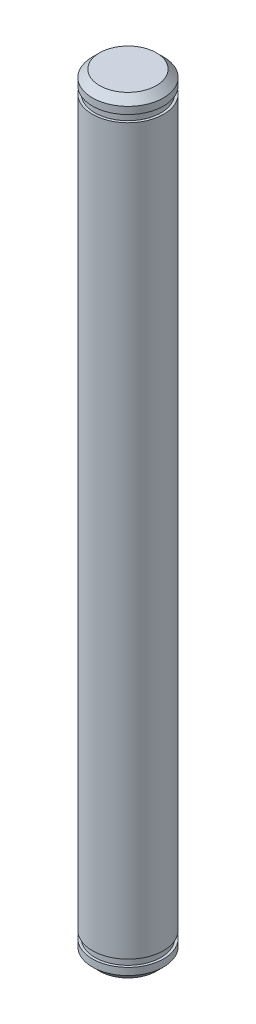
ISO-10303-21;
HEADER;
FILE_DESCRIPTION(('STEP AP214'),'2;1');
FILE_NAME('part.step','',(''),(''),'','','');
FILE_SCHEMA(('AUTOMOTIVE_DESIGN { 1 0 10303 214 1 1 1 1 }'));
ENDSEC;
DATA;
#1=APPLICATION_CONTEXT('core data for automotive mechanical design processes');
#2=APPLICATION_PROTOCOL_DEFINITION('international standard','automotive_design',2000,#1);
#3=PRODUCT_CONTEXT('',#1,'mechanical');
#4=PRODUCT('Part','Part','',(#3));
#5=PRODUCT_RELATED_PRODUCT_CATEGORY('part','',(#4));
#6=PRODUCT_DEFINITION_FORMATION('','',#4);
#7=PRODUCT_DEFINITION_CONTEXT('part definition',#1,'design');
#8=PRODUCT_DEFINITION('design','',#6,#7);
#9=PRODUCT_DEFINITION_SHAPE('','',#8);
#10=(LENGTH_UNIT() NAMED_UNIT(*) SI_UNIT(.MILLI.,.METRE.));
#11=(NAMED_UNIT(*) PLANE_ANGLE_UNIT() SI_UNIT($,.RADIAN.));
#12=(NAMED_UNIT(*) SI_UNIT($,.STERADIAN.) SOLID_ANGLE_UNIT());
#13=UNCERTAINTY_MEASURE_WITH_UNIT(LENGTH_MEASURE(1.E-05),#10,'distance_accuracy_value','');
#14=(GEOMETRIC_REPRESENTATION_CONTEXT(3) GLOBAL_UNCERTAINTY_ASSIGNED_CONTEXT((#13)) GLOBAL_UNIT_ASSIGNED_CONTEXT((#10,
#11,#12)) REPRESENTATION_CONTEXT('',''));
#15=CARTESIAN_POINT('',(0.,0.,0.));
#16=DIRECTION('',(0.,0.,1.));
#17=DIRECTION('',(1.,0.,0.));
#18=AXIS2_PLACEMENT_3D('',#15,#16,#17);
#19=CARTESIAN_POINT('',(0.,54.,0.));
#20=DIRECTION('',(0.,1.,0.));
#21=DIRECTION('',(-1.,0.,0.));
#22=AXIS2_PLACEMENT_3D('',#19,#20,#21);
#23=CYLINDRICAL_SURFACE('',#22,5.00000000000001);
#24=CARTESIAN_POINT('',(0.,51.,0.));
#25=DIRECTION('',(0.,1.,0.));
#26=DIRECTION('',(-1.,0.,0.));
#27=AXIS2_PLACEMENT_3D('',#24,#25,#26);
#28=CIRCLE('',#27,5.00000000000001);
#29=CARTESIAN_POINT('',(-5.00000000000002,51.,0.));
#30=VERTEX_POINT('',#29);
#31=EDGE_CURVE('E57',#30,#30,#28,.T.);
#32=ORIENTED_EDGE('',*,*,#31,.F.);
#33=EDGE_LOOP('',(#32));
#34=FACE_BOUND('',#33,.T.);
#35=CARTESIAN_POINT('',(0.,-51.,0.));
#36=DIRECTION('',(0.,1.,0.));
#37=DIRECTION('',(-1.,0.,0.));
#38=AXIS2_PLACEMENT_3D('',#35,#36,#37);
#39=CIRCLE('',#38,5.00000000000001);
#40=CARTESIAN_POINT('',(-5.,-51.,0.));
#41=VERTEX_POINT('',#40);
#42=EDGE_CURVE('E69',#41,#41,#39,.T.);
#43=ORIENTED_EDGE('',*,*,#42,.T.);
#44=EDGE_LOOP('',(#43));
#45=FACE_BOUND('',#44,.T.);
#46=ADVANCED_FACE('F35',(#34,#45),#23,.T.);
#47=CARTESIAN_POINT('',(0.,54.,0.));
#48=DIRECTION('',(0.,-1.,0.));
#49=DIRECTION('',(1.,0.,0.));
#50=AXIS2_PLACEMENT_3D('',#47,#48,#49);
#51=PLANE('',#50);
#52=CARTESIAN_POINT('',(0.,54.,0.));
#53=DIRECTION('',(0.,-1.,0.));
#54=DIRECTION('',(1.,0.,0.));
#55=AXIS2_PLACEMENT_3D('',#52,#53,#54);
#56=CIRCLE('',#55,4.00000000000002);
#57=CARTESIAN_POINT('',(4.,54.,0.));
#58=VERTEX_POINT('',#57);
#59=EDGE_CURVE('E10',#58,#58,#56,.F.);
#60=ORIENTED_EDGE('',*,*,#59,.T.);
#61=EDGE_LOOP('',(#60));
#62=FACE_BOUND('',#61,.T.);
#63=ADVANCED_FACE('F111',(#62),#51,.F.);
#64=CARTESIAN_POINT('',(0.,52.,0.));
#65=DIRECTION('',(0.,1.,0.));
#66=DIRECTION('',(-1.,0.,0.));
#67=AXIS2_PLACEMENT_3D('',#64,#65,#66);
#68=CIRCLE('',#67,5.00000000000001);
#69=CARTESIAN_POINT('',(-5.00000000000002,52.,0.));
#70=VERTEX_POINT('',#69);
#71=EDGE_CURVE('E56',#70,#70,#68,.T.);
#72=ORIENTED_EDGE('',*,*,#71,.T.);
#73=EDGE_LOOP('',(#72));
#74=FACE_BOUND('',#73,.T.);
#75=CARTESIAN_POINT('',(0.,53.,0.));
#76=DIRECTION('',(0.,-1.,0.));
#77=DIRECTION('',(1.,0.,0.));
#78=AXIS2_PLACEMENT_3D('',#75,#76,#77);
#79=CIRCLE('',#78,5.00000000000001);
#80=CARTESIAN_POINT('',(4.99999999999999,53.,0.));
#81=VERTEX_POINT('',#80);
#82=EDGE_CURVE('E51',#81,#81,#79,.T.);
#83=ORIENTED_EDGE('',*,*,#82,.T.);
#84=EDGE_LOOP('',(#83));
#85=FACE_BOUND('',#84,.T.);
#86=ADVANCED_FACE('F97',(#74,#85),#23,.T.);
#87=CARTESIAN_POINT('',(0.,54.,0.));
#88=DIRECTION('',(0.,-1.,0.));
#89=DIRECTION('',(1.,0.,0.));
#90=AXIS2_PLACEMENT_3D('',#87,#88,#89);
#91=CONICAL_SURFACE('',#90,4.00000000000002,0.785398163397446);
#92=ORIENTED_EDGE('',*,*,#82,.F.);
#93=EDGE_LOOP('',(#92));
#94=FACE_BOUND('',#93,.T.);
#95=ORIENTED_EDGE('',*,*,#59,.F.);
#96=EDGE_LOOP('',(#95));
#97=FACE_BOUND('',#96,.T.);
#98=ADVANCED_FACE('F38',(#94,#97),#91,.T.);
#99=CARTESIAN_POINT('',(0.,52.,0.));
#100=DIRECTION('',(0.,1.,0.));
#101=DIRECTION('',(-1.,0.,0.));
#102=AXIS2_PLACEMENT_3D('',#99,#100,#101);
#103=PLANE('',#102);
#104=ORIENTED_EDGE('',*,*,#71,.F.);
#105=EDGE_LOOP('',(#104));
#106=FACE_BOUND('',#105,.T.);
#107=CARTESIAN_POINT('',(0.,52.,0.));
#108=DIRECTION('',(0.,1.,0.));
#109=DIRECTION('',(-1.,0.,0.));
#110=AXIS2_PLACEMENT_3D('',#107,#108,#109);
#111=CIRCLE('',#110,4.65);
#112=CARTESIAN_POINT('',(-4.65000000000002,52.,0.));
#113=VERTEX_POINT('',#112);
#114=EDGE_CURVE('E60',#113,#113,#111,.T.);
#115=ORIENTED_EDGE('',*,*,#114,.T.);
#116=EDGE_LOOP('',(#115));
#117=FACE_BOUND('',#116,.T.);
#118=ADVANCED_FACE('F126',(#106,#117),#103,.F.);
#119=CARTESIAN_POINT('',(0.,51.,0.));
#120=DIRECTION('',(0.,1.,0.));
#121=DIRECTION('',(-1.,0.,0.));
#122=AXIS2_PLACEMENT_3D('',#119,#120,#121);
#123=PLANE('',#122);
#124=ORIENTED_EDGE('',*,*,#31,.T.);
#125=EDGE_LOOP('',(#124));
#126=FACE_BOUND('',#125,.T.);
#127=CARTESIAN_POINT('',(0.,51.,0.));
#128=DIRECTION('',(0.,1.,0.));
#129=DIRECTION('',(-1.,0.,0.));
#130=AXIS2_PLACEMENT_3D('',#127,#128,#129);
#131=CIRCLE('',#130,4.65);
#132=CARTESIAN_POINT('',(-4.65000000000002,51.,0.));
#133=VERTEX_POINT('',#132);
#134=EDGE_CURVE('E63',#133,#133,#131,.T.);
#135=ORIENTED_EDGE('',*,*,#134,.F.);
#136=EDGE_LOOP('',(#135));
#137=FACE_BOUND('',#136,.T.);
#138=ADVANCED_FACE('F135',(#126,#137),#123,.T.);
#139=CARTESIAN_POINT('',(0.,52.,0.));
#140=DIRECTION('',(0.,-1.,0.));
#141=DIRECTION('',(1.,0.,0.));
#142=AXIS2_PLACEMENT_3D('',#139,#140,#141);
#143=CYLINDRICAL_SURFACE('',#142,4.65);
#144=ORIENTED_EDGE('',*,*,#114,.F.);
#145=EDGE_LOOP('',(#144));
#146=FACE_BOUND('',#145,.T.);
#147=ORIENTED_EDGE('',*,*,#134,.T.);
#148=EDGE_LOOP('',(#147));
#149=FACE_BOUND('',#148,.T.);
#150=ADVANCED_FACE('F88',(#146,#149),#143,.T.);
#151=CARTESIAN_POINT('',(0.,-52.,0.));
#152=DIRECTION('',(0.,-1.,0.));
#153=DIRECTION('',(-1.,0.,0.));
#154=AXIS2_PLACEMENT_3D('',#151,#152,#153);
#155=PLANE('',#154);
#156=CARTESIAN_POINT('',(0.,-52.,0.));
#157=DIRECTION('',(0.,1.,0.));
#158=DIRECTION('',(-1.,0.,0.));
#159=AXIS2_PLACEMENT_3D('',#156,#157,#158);
#160=CIRCLE('',#159,4.65);
#161=CARTESIAN_POINT('',(-4.64999999999999,-52.,0.));
#162=VERTEX_POINT('',#161);
#163=EDGE_CURVE('E72',#162,#162,#160,.T.);
#164=ORIENTED_EDGE('',*,*,#163,.F.);
#165=EDGE_LOOP('',(#164));
#166=FACE_BOUND('',#165,.T.);
#167=CARTESIAN_POINT('',(0.,-52.,0.));
#168=DIRECTION('',(0.,1.,0.));
#169=DIRECTION('',(-1.,0.,0.));
#170=AXIS2_PLACEMENT_3D('',#167,#168,#169);
#171=CIRCLE('',#170,5.00000000000001);
#172=CARTESIAN_POINT('',(-5.,-52.,0.));
#173=VERTEX_POINT('',#172);
#174=EDGE_CURVE('E66',#173,#173,#171,.T.);
#175=ORIENTED_EDGE('',*,*,#174,.T.);
#176=EDGE_LOOP('',(#175));
#177=FACE_BOUND('',#176,.T.);
#178=ADVANCED_FACE('F84',(#166,#177),#155,.F.);
#179=CARTESIAN_POINT('',(0.,-51.,0.));
#180=DIRECTION('',(0.,-1.,0.));
#181=DIRECTION('',(-1.,0.,0.));
#182=AXIS2_PLACEMENT_3D('',#179,#180,#181);
#183=PLANE('',#182);
#184=CARTESIAN_POINT('',(0.,-51.,0.));
#185=DIRECTION('',(0.,1.,0.));
#186=DIRECTION('',(-1.,0.,0.));
#187=AXIS2_PLACEMENT_3D('',#184,#185,#186);
#188=CIRCLE('',#187,4.65);
#189=CARTESIAN_POINT('',(-4.64999999999999,-51.,0.));
#190=VERTEX_POINT('',#189);
#191=EDGE_CURVE('E75',#190,#190,#188,.T.);
#192=ORIENTED_EDGE('',*,*,#191,.T.);
#193=EDGE_LOOP('',(#192));
#194=FACE_BOUND('',#193,.T.);
#195=ORIENTED_EDGE('',*,*,#42,.F.);
#196=EDGE_LOOP('',(#195));
#197=FACE_BOUND('',#196,.T.);
#198=ADVANCED_FACE('F87',(#194,#197),#183,.T.);
#199=CARTESIAN_POINT('',(0.,-52.,0.));
#200=DIRECTION('',(0.,1.,0.));
#201=DIRECTION('',(-1.,0.,0.));
#202=AXIS2_PLACEMENT_3D('',#199,#200,#201);
#203=CYLINDRICAL_SURFACE('',#202,4.65);
#204=ORIENTED_EDGE('',*,*,#163,.T.);
#205=EDGE_LOOP('',(#204));
#206=FACE_BOUND('',#205,.T.);
#207=ORIENTED_EDGE('',*,*,#191,.F.);
#208=EDGE_LOOP('',(#207));
#209=FACE_BOUND('',#208,.T.);
#210=ADVANCED_FACE('F81',(#206,#209),#203,.T.);
#211=CARTESIAN_POINT('',(5.00000000000001,-54.,0.));
#212=DIRECTION('',(0.,1.,0.));
#213=DIRECTION('',(-1.,0.,0.));
#214=AXIS2_PLACEMENT_3D('',#211,#212,#213);
#215=PLANE('',#214);
#216=CARTESIAN_POINT('',(0.,-54.,0.));
#217=DIRECTION('',(0.,1.,0.));
#218=DIRECTION('',(-1.,0.,0.));
#219=AXIS2_PLACEMENT_3D('',#216,#217,#218);
#220=CIRCLE('',#219,3.99999999999999);
#221=CARTESIAN_POINT('',(-3.99999999999998,-54.,0.));
#222=VERTEX_POINT('',#221);
#223=EDGE_CURVE('E43',#222,#222,#220,.F.);
#224=ORIENTED_EDGE('',*,*,#223,.T.);
#225=EDGE_LOOP('',(#224));
#226=FACE_BOUND('',#225,.T.);
#227=ADVANCED_FACE('F101',(#226),#215,.F.);
#228=CARTESIAN_POINT('',(0.,-53.,0.));
#229=DIRECTION('',(0.,1.,0.));
#230=DIRECTION('',(-1.,0.,0.));
#231=AXIS2_PLACEMENT_3D('',#228,#229,#230);
#232=CONICAL_SURFACE('',#231,5.00000000000001,0.78539816339745);
#233=ORIENTED_EDGE('',*,*,#223,.F.);
#234=EDGE_LOOP('',(#233));
#235=FACE_BOUND('',#234,.T.);
#236=CARTESIAN_POINT('',(0.,-53.,0.));
#237=DIRECTION('',(0.,1.,0.));
#238=DIRECTION('',(-1.,0.,0.));
#239=AXIS2_PLACEMENT_3D('',#236,#237,#238);
#240=CIRCLE('',#239,5.00000000000001);
#241=CARTESIAN_POINT('',(-5.,-53.,0.));
#242=VERTEX_POINT('',#241);
#243=EDGE_CURVE('E47',#242,#242,#240,.T.);
#244=ORIENTED_EDGE('',*,*,#243,.F.);
#245=EDGE_LOOP('',(#244));
#246=FACE_BOUND('',#245,.T.);
#247=ADVANCED_FACE('F95',(#235,#246),#232,.T.);
#248=ORIENTED_EDGE('',*,*,#174,.F.);
#249=EDGE_LOOP('',(#248));
#250=FACE_BOUND('',#249,.T.);
#251=ORIENTED_EDGE('',*,*,#243,.T.);
#252=EDGE_LOOP('',(#251));
#253=FACE_BOUND('',#252,.T.);
#254=ADVANCED_FACE('F92',(#250,#253),#23,.T.);
#255=CLOSED_SHELL('',(#46,#63,#86,#98,#118,#138,#150,#178,#198,#210,#227,#247,#254));
#256=MANIFOLD_SOLID_BREP('B2',#255);
#257=ADVANCED_BREP_SHAPE_REPRESENTATION('',(#18,#256),#14);
#258=SHAPE_DEFINITION_REPRESENTATION(#9,#257);
ENDSEC;
END-ISO-10303-21;
